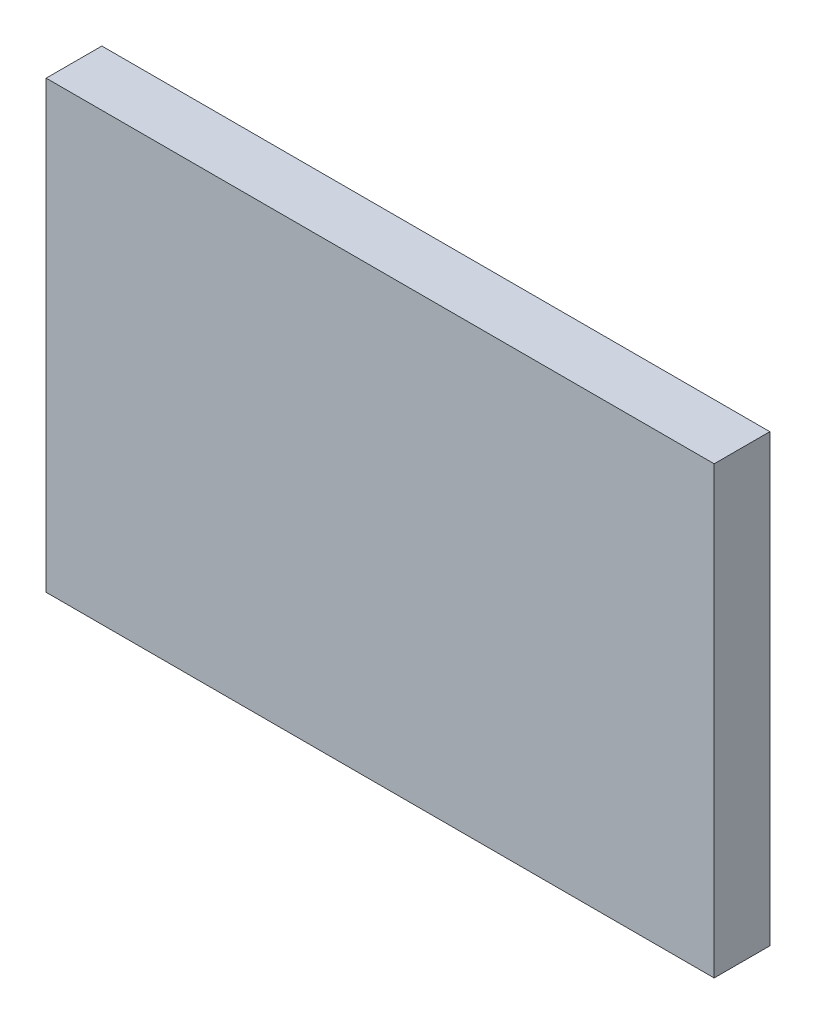
ISO-10303-21;
HEADER;
FILE_DESCRIPTION(('STEP AP214'),'2;1');
FILE_NAME('part.step','',(''),(''),'','','');
FILE_SCHEMA(('AUTOMOTIVE_DESIGN { 1 0 10303 214 1 1 1 1 }'));
ENDSEC;
DATA;
#1=APPLICATION_CONTEXT('core data for automotive mechanical design processes');
#2=APPLICATION_PROTOCOL_DEFINITION('international standard','automotive_design',2000,#1);
#3=PRODUCT_CONTEXT('',#1,'mechanical');
#4=PRODUCT('Part','Part','',(#3));
#5=PRODUCT_RELATED_PRODUCT_CATEGORY('part','',(#4));
#6=PRODUCT_DEFINITION_FORMATION('','',#4);
#7=PRODUCT_DEFINITION_CONTEXT('part definition',#1,'design');
#8=PRODUCT_DEFINITION('design','',#6,#7);
#9=PRODUCT_DEFINITION_SHAPE('','',#8);
#10=(LENGTH_UNIT() NAMED_UNIT(*) SI_UNIT(.MILLI.,.METRE.));
#11=(NAMED_UNIT(*) PLANE_ANGLE_UNIT() SI_UNIT($,.RADIAN.));
#12=(NAMED_UNIT(*) SI_UNIT($,.STERADIAN.) SOLID_ANGLE_UNIT());
#13=UNCERTAINTY_MEASURE_WITH_UNIT(LENGTH_MEASURE(1.E-05),#10,'distance_accuracy_value','');
#14=(GEOMETRIC_REPRESENTATION_CONTEXT(3) GLOBAL_UNCERTAINTY_ASSIGNED_CONTEXT((#13)) GLOBAL_UNIT_ASSIGNED_CONTEXT((#10,
#11,#12)) REPRESENTATION_CONTEXT('',''));
#15=CARTESIAN_POINT('',(0.,0.,0.));
#16=DIRECTION('',(0.,0.,1.));
#17=DIRECTION('',(1.,0.,0.));
#18=AXIS2_PLACEMENT_3D('',#15,#16,#17);
#19=CARTESIAN_POINT('',(-76.2,-50.8,6.35));
#20=DIRECTION('',(-1.,0.,0.));
#21=DIRECTION('',(0.,0.,1.));
#22=AXIS2_PLACEMENT_3D('',#19,#20,#21);
#23=PLANE('',#22);
#24=DIRECTION('',(0.,1.,0.));
#25=VECTOR('',#24,1.);
#26=CARTESIAN_POINT('',(-76.2,-50.8,-6.35));
#27=LINE('',#26,#25);
#28=CARTESIAN_POINT('',(-76.2,-50.8,-6.35));
#29=VERTEX_POINT('',#28);
#30=CARTESIAN_POINT('',(-76.2,50.8,-6.35));
#31=VERTEX_POINT('',#30);
#32=EDGE_CURVE('E124',#29,#31,#27,.T.);
#33=ORIENTED_EDGE('',*,*,#32,.F.);
#34=DIRECTION('',(0.,0.,-1.));
#35=VECTOR('',#34,1.);
#36=CARTESIAN_POINT('',(-76.2,-50.8,6.35));
#37=LINE('',#36,#35);
#38=CARTESIAN_POINT('',(-76.2,-50.8,6.35));
#39=VERTEX_POINT('',#38);
#40=EDGE_CURVE('E11',#39,#29,#37,.T.);
#41=ORIENTED_EDGE('',*,*,#40,.F.);
#42=DIRECTION('',(0.,1.,0.));
#43=VECTOR('',#42,1.);
#44=CARTESIAN_POINT('',(-76.2,-50.8,6.35));
#45=LINE('',#44,#43);
#46=CARTESIAN_POINT('',(-76.2,50.8,6.35));
#47=VERTEX_POINT('',#46);
#48=EDGE_CURVE('E115',#39,#47,#45,.T.);
#49=ORIENTED_EDGE('',*,*,#48,.T.);
#50=DIRECTION('',(0.,0.,-1.));
#51=VECTOR('',#50,1.);
#52=CARTESIAN_POINT('',(-76.2,50.8,6.35));
#53=LINE('',#52,#51);
#54=EDGE_CURVE('E46',#47,#31,#53,.T.);
#55=ORIENTED_EDGE('',*,*,#54,.T.);
#56=EDGE_LOOP('',(#33,#41,#49,#55));
#57=FACE_BOUND('',#56,.T.);
#58=ADVANCED_FACE('F43',(#57),#23,.T.);
#59=CARTESIAN_POINT('',(-76.2,-50.8,6.35));
#60=DIRECTION('',(0.,1.,0.));
#61=DIRECTION('',(0.,0.,1.));
#62=AXIS2_PLACEMENT_3D('',#59,#60,#61);
#63=PLANE('',#62);
#64=DIRECTION('',(1.,0.,0.));
#65=VECTOR('',#64,1.);
#66=CARTESIAN_POINT('',(-76.2,-50.8,-6.35));
#67=LINE('',#66,#65);
#68=CARTESIAN_POINT('',(76.2,-50.8,-6.35));
#69=VERTEX_POINT('',#68);
#70=EDGE_CURVE('E84',#29,#69,#67,.T.);
#71=ORIENTED_EDGE('',*,*,#70,.T.);
#72=DIRECTION('',(0.,0.,-1.));
#73=VECTOR('',#72,1.);
#74=CARTESIAN_POINT('',(76.2,-50.8,6.35));
#75=LINE('',#74,#73);
#76=CARTESIAN_POINT('',(76.2,-50.8,6.35));
#77=VERTEX_POINT('',#76);
#78=EDGE_CURVE('E53',#77,#69,#75,.T.);
#79=ORIENTED_EDGE('',*,*,#78,.F.);
#80=DIRECTION('',(1.,0.,0.));
#81=VECTOR('',#80,1.);
#82=CARTESIAN_POINT('',(-76.2,-50.8,6.35));
#83=LINE('',#82,#81);
#84=EDGE_CURVE('E102',#39,#77,#83,.T.);
#85=ORIENTED_EDGE('',*,*,#84,.F.);
#86=ORIENTED_EDGE('',*,*,#40,.T.);
#87=EDGE_LOOP('',(#71,#79,#85,#86));
#88=FACE_BOUND('',#87,.T.);
#89=ADVANCED_FACE('F138',(#88),#63,.F.);
#90=CARTESIAN_POINT('',(76.2,-50.8,6.35));
#91=DIRECTION('',(-1.,0.,0.));
#92=DIRECTION('',(0.,0.,1.));
#93=AXIS2_PLACEMENT_3D('',#90,#91,#92);
#94=PLANE('',#93);
#95=DIRECTION('',(0.,1.,0.));
#96=VECTOR('',#95,1.);
#97=CARTESIAN_POINT('',(76.2,-50.8,-6.35));
#98=LINE('',#97,#96);
#99=CARTESIAN_POINT('',(76.2,50.8,-6.35));
#100=VERTEX_POINT('',#99);
#101=EDGE_CURVE('E110',#69,#100,#98,.T.);
#102=ORIENTED_EDGE('',*,*,#101,.T.);
#103=DIRECTION('',(0.,0.,-1.));
#104=VECTOR('',#103,1.);
#105=CARTESIAN_POINT('',(76.2,50.8,6.35));
#106=LINE('',#105,#104);
#107=CARTESIAN_POINT('',(76.2,50.8,6.35));
#108=VERTEX_POINT('',#107);
#109=EDGE_CURVE('E107',#108,#100,#106,.T.);
#110=ORIENTED_EDGE('',*,*,#109,.F.);
#111=DIRECTION('',(0.,1.,0.));
#112=VECTOR('',#111,1.);
#113=CARTESIAN_POINT('',(76.2,-50.8,6.35));
#114=LINE('',#113,#112);
#115=EDGE_CURVE('E97',#77,#108,#114,.T.);
#116=ORIENTED_EDGE('',*,*,#115,.F.);
#117=ORIENTED_EDGE('',*,*,#78,.T.);
#118=EDGE_LOOP('',(#102,#110,#116,#117));
#119=FACE_BOUND('',#118,.T.);
#120=ADVANCED_FACE('F108',(#119),#94,.F.);
#121=CARTESIAN_POINT('',(-76.2,50.8,6.35));
#122=DIRECTION('',(0.,1.,0.));
#123=DIRECTION('',(0.,0.,1.));
#124=AXIS2_PLACEMENT_3D('',#121,#122,#123);
#125=PLANE('',#124);
#126=DIRECTION('',(1.,0.,0.));
#127=VECTOR('',#126,1.);
#128=CARTESIAN_POINT('',(-76.2,50.8,-6.35));
#129=LINE('',#128,#127);
#130=EDGE_CURVE('E127',#31,#100,#129,.T.);
#131=ORIENTED_EDGE('',*,*,#130,.F.);
#132=ORIENTED_EDGE('',*,*,#54,.F.);
#133=DIRECTION('',(1.,0.,0.));
#134=VECTOR('',#133,1.);
#135=CARTESIAN_POINT('',(-76.2,50.8,6.35));
#136=LINE('',#135,#134);
#137=EDGE_CURVE('E101',#47,#108,#136,.T.);
#138=ORIENTED_EDGE('',*,*,#137,.T.);
#139=ORIENTED_EDGE('',*,*,#109,.T.);
#140=EDGE_LOOP('',(#131,#132,#138,#139));
#141=FACE_BOUND('',#140,.T.);
#142=ADVANCED_FACE('F113',(#141),#125,.T.);
#143=CARTESIAN_POINT('',(0.,0.,6.35));
#144=DIRECTION('',(0.,0.,-1.));
#145=DIRECTION('',(-1.,0.,0.));
#146=AXIS2_PLACEMENT_3D('',#143,#144,#145);
#147=PLANE('',#146);
#148=ORIENTED_EDGE('',*,*,#48,.F.);
#149=ORIENTED_EDGE('',*,*,#84,.T.);
#150=ORIENTED_EDGE('',*,*,#115,.T.);
#151=ORIENTED_EDGE('',*,*,#137,.F.);
#152=EDGE_LOOP('',(#148,#149,#150,#151));
#153=FACE_BOUND('',#152,.T.);
#154=ADVANCED_FACE('F100',(#153),#147,.F.);
#155=CARTESIAN_POINT('',(0.,0.,-6.35));
#156=DIRECTION('',(0.,0.,-1.));
#157=DIRECTION('',(-1.,0.,0.));
#158=AXIS2_PLACEMENT_3D('',#155,#156,#157);
#159=PLANE('',#158);
#160=ORIENTED_EDGE('',*,*,#32,.T.);
#161=ORIENTED_EDGE('',*,*,#130,.T.);
#162=ORIENTED_EDGE('',*,*,#101,.F.);
#163=ORIENTED_EDGE('',*,*,#70,.F.);
#164=EDGE_LOOP('',(#160,#161,#162,#163));
#165=FACE_BOUND('',#164,.T.);
#166=ADVANCED_FACE('F135',(#165),#159,.T.);
#167=CLOSED_SHELL('',(#58,#89,#120,#142,#154,#166));
#168=MANIFOLD_SOLID_BREP('B2',#167);
#169=ADVANCED_BREP_SHAPE_REPRESENTATION('',(#18,#168),#14);
#170=SHAPE_DEFINITION_REPRESENTATION(#9,#169);
ENDSEC;
END-ISO-10303-21;
